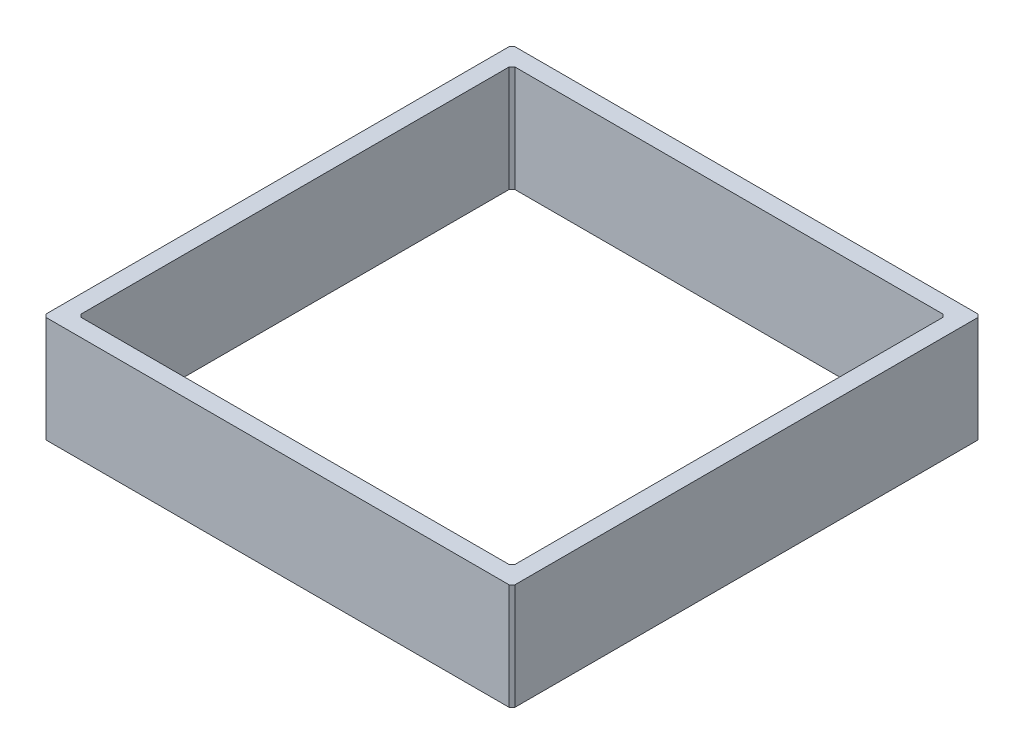
ISO-10303-21;
HEADER;
FILE_DESCRIPTION(('STEP AP214'),'2;1');
FILE_NAME('part.step','',(''),(''),'','','');
FILE_SCHEMA(('AUTOMOTIVE_DESIGN { 1 0 10303 214 1 1 1 1 }'));
ENDSEC;
DATA;
#1=APPLICATION_CONTEXT('core data for automotive mechanical design processes');
#2=APPLICATION_PROTOCOL_DEFINITION('international standard','automotive_design',2000,#1);
#3=PRODUCT_CONTEXT('',#1,'mechanical');
#4=PRODUCT('Part','Part','',(#3));
#5=PRODUCT_RELATED_PRODUCT_CATEGORY('part','',(#4));
#6=PRODUCT_DEFINITION_FORMATION('','',#4);
#7=PRODUCT_DEFINITION_CONTEXT('part definition',#1,'design');
#8=PRODUCT_DEFINITION('design','',#6,#7);
#9=PRODUCT_DEFINITION_SHAPE('','',#8);
#10=(LENGTH_UNIT() NAMED_UNIT(*) SI_UNIT(.MILLI.,.METRE.));
#11=(NAMED_UNIT(*) PLANE_ANGLE_UNIT() SI_UNIT($,.RADIAN.));
#12=(NAMED_UNIT(*) SI_UNIT($,.STERADIAN.) SOLID_ANGLE_UNIT());
#13=UNCERTAINTY_MEASURE_WITH_UNIT(LENGTH_MEASURE(1.E-05),#10,'distance_accuracy_value','');
#14=(GEOMETRIC_REPRESENTATION_CONTEXT(3) GLOBAL_UNCERTAINTY_ASSIGNED_CONTEXT((#13)) GLOBAL_UNIT_ASSIGNED_CONTEXT((#10,
#11,#12)) REPRESENTATION_CONTEXT('',''));
#15=CARTESIAN_POINT('',(0.,0.,0.));
#16=DIRECTION('',(0.,0.,1.));
#17=DIRECTION('',(1.,0.,0.));
#18=AXIS2_PLACEMENT_3D('',#15,#16,#17);
#19=CARTESIAN_POINT('',(66.621580604534,-28.7528,40.2390144836272));
#20=DIRECTION('',(-0.707106781186551,0.,-0.707106781186544));
#21=DIRECTION('',(-0.707106781186544,0.,0.707106781186551));
#22=AXIS2_PLACEMENT_3D('',#19,#20,#21);
#23=PLANE('',#22);
#24=DIRECTION('',(-0.707106781186544,0.,0.707106781186551));
#25=VECTOR('',#24,1.);
#26=CARTESIAN_POINT('',(66.621580604534,0.,40.2390144836272));
#27=LINE('',#26,#25);
#28=CARTESIAN_POINT('',(65.827830604534,0.,41.0327644836272));
#29=VERTEX_POINT('',#28);
#30=CARTESIAN_POINT('',(66.621580604534,0.,40.2390144836272));
#31=VERTEX_POINT('',#30);
#32=EDGE_CURVE('E205',#29,#31,#27,.F.);
#33=ORIENTED_EDGE('',*,*,#32,.T.);
#34=DIRECTION('',(0.,1.,0.));
#35=VECTOR('',#34,1.);
#36=CARTESIAN_POINT('',(66.621580604534,-28.7528,40.2390144836272));
#37=LINE('',#36,#35);
#38=CARTESIAN_POINT('',(66.621580604534,-28.7528,40.2390144836272));
#39=VERTEX_POINT('',#38);
#40=EDGE_CURVE('E188',#31,#39,#37,.F.);
#41=ORIENTED_EDGE('',*,*,#40,.T.);
#42=DIRECTION('',(-0.707106781186544,0.,0.707106781186551));
#43=VECTOR('',#42,1.);
#44=CARTESIAN_POINT('',(66.621580604534,-28.7528,40.2390144836272));
#45=LINE('',#44,#43);
#46=CARTESIAN_POINT('',(65.827830604534,-28.7528,41.0327644836272));
#47=VERTEX_POINT('',#46);
#48=EDGE_CURVE('E20',#39,#47,#45,.T.);
#49=ORIENTED_EDGE('',*,*,#48,.T.);
#50=DIRECTION('',(0.,1.,0.));
#51=VECTOR('',#50,1.);
#52=CARTESIAN_POINT('',(65.827830604534,-28.7528,41.0327644836272));
#53=LINE('',#52,#51);
#54=EDGE_CURVE('E154',#47,#29,#53,.T.);
#55=ORIENTED_EDGE('',*,*,#54,.T.);
#56=EDGE_LOOP('',(#33,#41,#49,#55));
#57=FACE_BOUND('',#56,.T.);
#58=ADVANCED_FACE('F17',(#57),#23,.T.);
#59=CARTESIAN_POINT('',(-50.059669395466,-28.7528,41.0327644836272));
#60=DIRECTION('',(0.707106781186551,0.,-0.707106781186544));
#61=DIRECTION('',(-0.707106781186544,0.,-0.707106781186551));
#62=AXIS2_PLACEMENT_3D('',#59,#60,#61);
#63=PLANE('',#62);
#64=DIRECTION('',(-0.707106781186544,0.,-0.707106781186551));
#65=VECTOR('',#64,1.);
#66=CARTESIAN_POINT('',(-50.059669395466,0.,41.0327644836272));
#67=LINE('',#66,#65);
#68=CARTESIAN_POINT('',(-50.853419395466,0.,40.2390144836272));
#69=VERTEX_POINT('',#68);
#70=CARTESIAN_POINT('',(-50.059669395466,0.,41.0327644836272));
#71=VERTEX_POINT('',#70);
#72=EDGE_CURVE('E128',#69,#71,#67,.F.);
#73=ORIENTED_EDGE('',*,*,#72,.T.);
#74=DIRECTION('',(0.,1.,0.));
#75=VECTOR('',#74,1.);
#76=CARTESIAN_POINT('',(-50.059669395466,-28.7528,41.0327644836272));
#77=LINE('',#76,#75);
#78=CARTESIAN_POINT('',(-50.059669395466,-28.7528,41.0327644836272));
#79=VERTEX_POINT('',#78);
#80=EDGE_CURVE('E182',#71,#79,#77,.F.);
#81=ORIENTED_EDGE('',*,*,#80,.T.);
#82=DIRECTION('',(-0.707106781186544,0.,-0.707106781186551));
#83=VECTOR('',#82,1.);
#84=CARTESIAN_POINT('',(-50.059669395466,-28.7528,41.0327644836272));
#85=LINE('',#84,#83);
#86=CARTESIAN_POINT('',(-50.853419395466,-28.7528,40.2390144836272));
#87=VERTEX_POINT('',#86);
#88=EDGE_CURVE('E204',#79,#87,#85,.T.);
#89=ORIENTED_EDGE('',*,*,#88,.T.);
#90=DIRECTION('',(0.,1.,0.));
#91=VECTOR('',#90,1.);
#92=CARTESIAN_POINT('',(-50.853419395466,-28.7528,40.2390144836272));
#93=LINE('',#92,#91);
#94=EDGE_CURVE('E153',#87,#69,#93,.T.);
#95=ORIENTED_EDGE('',*,*,#94,.T.);
#96=EDGE_LOOP('',(#73,#81,#89,#95));
#97=FACE_BOUND('',#96,.T.);
#98=ADVANCED_FACE('F409',(#97),#63,.T.);
#99=CARTESIAN_POINT('',(-50.853419395466,-28.7528,-75.6484855163728));
#100=DIRECTION('',(0.707106781186548,0.,0.707106781186548));
#101=DIRECTION('',(0.707106781186548,0.,-0.707106781186548));
#102=AXIS2_PLACEMENT_3D('',#99,#100,#101);
#103=PLANE('',#102);
#104=DIRECTION('',(0.707106781186548,0.,-0.707106781186548));
#105=VECTOR('',#104,1.);
#106=CARTESIAN_POINT('',(-50.853419395466,0.,-75.6484855163728));
#107=LINE('',#106,#105);
#108=CARTESIAN_POINT('',(-50.059669395466,0.,-76.4422355163728));
#109=VERTEX_POINT('',#108);
#110=CARTESIAN_POINT('',(-50.853419395466,0.,-75.6484855163728));
#111=VERTEX_POINT('',#110);
#112=EDGE_CURVE('E134',#109,#111,#107,.F.);
#113=ORIENTED_EDGE('',*,*,#112,.T.);
#114=DIRECTION('',(0.,1.,0.));
#115=VECTOR('',#114,1.);
#116=CARTESIAN_POINT('',(-50.853419395466,-28.7528,-75.6484855163728));
#117=LINE('',#116,#115);
#118=CARTESIAN_POINT('',(-50.853419395466,-28.7528,-75.6484855163728));
#119=VERTEX_POINT('',#118);
#120=EDGE_CURVE('E137',#111,#119,#117,.F.);
#121=ORIENTED_EDGE('',*,*,#120,.T.);
#122=DIRECTION('',(0.707106781186548,0.,-0.707106781186548));
#123=VECTOR('',#122,1.);
#124=CARTESIAN_POINT('',(-50.853419395466,-28.7528,-75.6484855163728));
#125=LINE('',#124,#123);
#126=CARTESIAN_POINT('',(-50.059669395466,-28.7528,-76.4422355163728));
#127=VERTEX_POINT('',#126);
#128=EDGE_CURVE('E144',#119,#127,#125,.T.);
#129=ORIENTED_EDGE('',*,*,#128,.T.);
#130=DIRECTION('',(0.,1.,0.));
#131=VECTOR('',#130,1.);
#132=CARTESIAN_POINT('',(-50.059669395466,-28.7528,-76.4422355163728));
#133=LINE('',#132,#131);
#134=EDGE_CURVE('E140',#127,#109,#133,.T.);
#135=ORIENTED_EDGE('',*,*,#134,.T.);
#136=EDGE_LOOP('',(#113,#121,#129,#135));
#137=FACE_BOUND('',#136,.T.);
#138=ADVANCED_FACE('F136',(#137),#103,.T.);
#139=CARTESIAN_POINT('',(65.827830604534,-28.7528,-76.4422355163728));
#140=DIRECTION('',(-0.707106781186548,0.,0.707106781186548));
#141=DIRECTION('',(0.707106781186548,0.,0.707106781186548));
#142=AXIS2_PLACEMENT_3D('',#139,#140,#141);
#143=PLANE('',#142);
#144=DIRECTION('',(0.707106781186548,0.,0.707106781186548));
#145=VECTOR('',#144,1.);
#146=CARTESIAN_POINT('',(65.827830604534,0.,-76.4422355163728));
#147=LINE('',#146,#145);
#148=CARTESIAN_POINT('',(66.621580604534,0.,-75.6484855163728));
#149=VERTEX_POINT('',#148);
#150=CARTESIAN_POINT('',(65.827830604534,0.,-76.4422355163728));
#151=VERTEX_POINT('',#150);
#152=EDGE_CURVE('E199',#149,#151,#147,.F.);
#153=ORIENTED_EDGE('',*,*,#152,.T.);
#154=DIRECTION('',(0.,1.,0.));
#155=VECTOR('',#154,1.);
#156=CARTESIAN_POINT('',(65.827830604534,-28.7528,-76.4422355163728));
#157=LINE('',#156,#155);
#158=CARTESIAN_POINT('',(65.827830604534,-28.7528,-76.4422355163728));
#159=VERTEX_POINT('',#158);
#160=EDGE_CURVE('E175',#151,#159,#157,.F.);
#161=ORIENTED_EDGE('',*,*,#160,.T.);
#162=DIRECTION('',(0.707106781186548,0.,0.707106781186548));
#163=VECTOR('',#162,1.);
#164=CARTESIAN_POINT('',(65.827830604534,-28.7528,-76.4422355163728));
#165=LINE('',#164,#163);
#166=CARTESIAN_POINT('',(66.621580604534,-28.7528,-75.6484855163728));
#167=VERTEX_POINT('',#166);
#168=EDGE_CURVE('E143',#159,#167,#165,.T.);
#169=ORIENTED_EDGE('',*,*,#168,.T.);
#170=DIRECTION('',(0.,1.,0.));
#171=VECTOR('',#170,1.);
#172=CARTESIAN_POINT('',(66.621580604534,-28.7528,-75.6484855163728));
#173=LINE('',#172,#171);
#174=EDGE_CURVE('E185',#167,#149,#173,.T.);
#175=ORIENTED_EDGE('',*,*,#174,.T.);
#176=EDGE_LOOP('',(#153,#161,#169,#175));
#177=FACE_BOUND('',#176,.T.);
#178=ADVANCED_FACE('F250',(#177),#143,.T.);
#179=CARTESIAN_POINT('',(71.384080604534,-28.7528,-80.4109855163728));
#180=DIRECTION('',(-0.707106781186541,0.,0.707106781186554));
#181=DIRECTION('',(0.707106781186554,0.,0.707106781186541));
#182=AXIS2_PLACEMENT_3D('',#179,#180,#181);
#183=PLANE('',#182);
#184=DIRECTION('',(0.,1.,0.));
#185=VECTOR('',#184,1.);
#186=CARTESIAN_POINT('',(70.590330604534,-28.7528,-81.2047355163728));
#187=LINE('',#186,#185);
#188=CARTESIAN_POINT('',(70.590330604534,0.,-81.2047355163728));
#189=VERTEX_POINT('',#188);
#190=CARTESIAN_POINT('',(70.590330604534,-28.7528,-81.2047355163728));
#191=VERTEX_POINT('',#190);
#192=EDGE_CURVE('E163',#189,#191,#187,.F.);
#193=ORIENTED_EDGE('',*,*,#192,.F.);
#194=DIRECTION('',(0.707106781186554,0.,0.707106781186541));
#195=VECTOR('',#194,1.);
#196=CARTESIAN_POINT('',(71.384080604534,0.,-80.4109855163728));
#197=LINE('',#196,#195);
#198=CARTESIAN_POINT('',(71.384080604534,0.,-80.4109855163728));
#199=VERTEX_POINT('',#198);
#200=EDGE_CURVE('E197',#199,#189,#197,.F.);
#201=ORIENTED_EDGE('',*,*,#200,.F.);
#202=DIRECTION('',(0.,1.,0.));
#203=VECTOR('',#202,1.);
#204=CARTESIAN_POINT('',(71.384080604534,-28.7528,-80.4109855163728));
#205=LINE('',#204,#203);
#206=CARTESIAN_POINT('',(71.384080604534,-28.7528,-80.4109855163728));
#207=VERTEX_POINT('',#206);
#208=EDGE_CURVE('E172',#207,#199,#205,.T.);
#209=ORIENTED_EDGE('',*,*,#208,.F.);
#210=DIRECTION('',(0.707106781186554,0.,0.707106781186541));
#211=VECTOR('',#210,1.);
#212=CARTESIAN_POINT('',(71.384080604534,-28.7528,-80.4109855163728));
#213=LINE('',#212,#211);
#214=EDGE_CURVE('E195',#191,#207,#213,.T.);
#215=ORIENTED_EDGE('',*,*,#214,.F.);
#216=EDGE_LOOP('',(#193,#201,#209,#215));
#217=FACE_BOUND('',#216,.T.);
#218=ADVANCED_FACE('F291',(#217),#183,.F.);
#219=CARTESIAN_POINT('',(70.590330604534,-28.7528,45.7952644836272));
#220=DIRECTION('',(-0.707106781186551,0.,-0.707106781186544));
#221=DIRECTION('',(-0.707106781186544,0.,0.707106781186551));
#222=AXIS2_PLACEMENT_3D('',#219,#220,#221);
#223=PLANE('',#222);
#224=DIRECTION('',(0.,1.,0.));
#225=VECTOR('',#224,1.);
#226=CARTESIAN_POINT('',(71.384080604534,-28.7528,45.0015144836272));
#227=LINE('',#226,#225);
#228=CARTESIAN_POINT('',(71.384080604534,0.,45.0015144836272));
#229=VERTEX_POINT('',#228);
#230=CARTESIAN_POINT('',(71.384080604534,-28.7528,45.0015144836272));
#231=VERTEX_POINT('',#230);
#232=EDGE_CURVE('E169',#229,#231,#227,.F.);
#233=ORIENTED_EDGE('',*,*,#232,.F.);
#234=DIRECTION('',(-0.707106781186544,0.,0.707106781186551));
#235=VECTOR('',#234,1.);
#236=CARTESIAN_POINT('',(70.590330604534,0.,45.7952644836272));
#237=LINE('',#236,#235);
#238=CARTESIAN_POINT('',(70.590330604534,0.,45.7952644836272));
#239=VERTEX_POINT('',#238);
#240=EDGE_CURVE('E193',#239,#229,#237,.F.);
#241=ORIENTED_EDGE('',*,*,#240,.F.);
#242=DIRECTION('',(0.,1.,0.));
#243=VECTOR('',#242,1.);
#244=CARTESIAN_POINT('',(70.590330604534,-28.7528,45.7952644836272));
#245=LINE('',#244,#243);
#246=CARTESIAN_POINT('',(70.590330604534,-28.7528,45.7952644836272));
#247=VERTEX_POINT('',#246);
#248=EDGE_CURVE('E158',#247,#239,#245,.T.);
#249=ORIENTED_EDGE('',*,*,#248,.F.);
#250=DIRECTION('',(-0.707106781186544,0.,0.707106781186551));
#251=VECTOR('',#250,1.);
#252=CARTESIAN_POINT('',(70.590330604534,-28.7528,45.7952644836272));
#253=LINE('',#252,#251);
#254=EDGE_CURVE('E191',#231,#247,#253,.T.);
#255=ORIENTED_EDGE('',*,*,#254,.F.);
#256=EDGE_LOOP('',(#233,#241,#249,#255));
#257=FACE_BOUND('',#256,.T.);
#258=ADVANCED_FACE('F300',(#257),#223,.F.);
#259=CARTESIAN_POINT('',(66.621580604534,-28.7528,41.0327644836272));
#260=DIRECTION('',(1.,0.,0.));
#261=DIRECTION('',(0.,0.,-1.));
#262=AXIS2_PLACEMENT_3D('',#259,#260,#261);
#263=PLANE('',#262);
#264=ORIENTED_EDGE('',*,*,#174,.F.);
#265=DIRECTION('',(0.,0.,1.));
#266=VECTOR('',#265,1.);
#267=CARTESIAN_POINT('',(66.621580604534,-28.7528,45.7952644836272));
#268=LINE('',#267,#266);
#269=EDGE_CURVE('E221',#167,#39,#268,.T.);
#270=ORIENTED_EDGE('',*,*,#269,.T.);
#271=ORIENTED_EDGE('',*,*,#40,.F.);
#272=DIRECTION('',(0.,0.,1.));
#273=VECTOR('',#272,1.);
#274=CARTESIAN_POINT('',(66.621580604534,0.,45.7952644836272));
#275=LINE('',#274,#273);
#276=EDGE_CURVE('E160',#149,#31,#275,.T.);
#277=ORIENTED_EDGE('',*,*,#276,.F.);
#278=EDGE_LOOP('',(#264,#270,#271,#277));
#279=FACE_BOUND('',#278,.T.);
#280=ADVANCED_FACE('F245',(#279),#263,.F.);
#281=CARTESIAN_POINT('',(-50.853419395466,-28.7528,41.0327644836272));
#282=DIRECTION('',(0.,0.,1.));
#283=DIRECTION('',(1.,0.,0.));
#284=AXIS2_PLACEMENT_3D('',#281,#282,#283);
#285=PLANE('',#284);
#286=ORIENTED_EDGE('',*,*,#54,.F.);
#287=DIRECTION('',(1.,0.,0.));
#288=VECTOR('',#287,1.);
#289=CARTESIAN_POINT('',(-55.615919395466,-28.7528,41.0327644836272));
#290=LINE('',#289,#288);
#291=EDGE_CURVE('E218',#47,#79,#290,.F.);
#292=ORIENTED_EDGE('',*,*,#291,.T.);
#293=ORIENTED_EDGE('',*,*,#80,.F.);
#294=DIRECTION('',(1.,0.,0.));
#295=VECTOR('',#294,1.);
#296=CARTESIAN_POINT('',(-55.615919395466,0.,41.0327644836272));
#297=LINE('',#296,#295);
#298=EDGE_CURVE('E219',#29,#71,#297,.F.);
#299=ORIENTED_EDGE('',*,*,#298,.F.);
#300=EDGE_LOOP('',(#286,#292,#293,#299));
#301=FACE_BOUND('',#300,.T.);
#302=ADVANCED_FACE('F216',(#301),#285,.F.);
#303=CARTESIAN_POINT('',(-50.853419395466,-28.7528,-76.4422355163728));
#304=DIRECTION('',(-1.,0.,0.));
#305=DIRECTION('',(0.,0.,1.));
#306=AXIS2_PLACEMENT_3D('',#303,#304,#305);
#307=PLANE('',#306);
#308=ORIENTED_EDGE('',*,*,#94,.F.);
#309=DIRECTION('',(0.,0.,1.));
#310=VECTOR('',#309,1.);
#311=CARTESIAN_POINT('',(-50.853419395466,-28.7528,45.7952644836272));
#312=LINE('',#311,#310);
#313=EDGE_CURVE('E152',#87,#119,#312,.F.);
#314=ORIENTED_EDGE('',*,*,#313,.T.);
#315=ORIENTED_EDGE('',*,*,#120,.F.);
#316=DIRECTION('',(0.,0.,1.));
#317=VECTOR('',#316,1.);
#318=CARTESIAN_POINT('',(-50.853419395466,0.,45.7952644836272));
#319=LINE('',#318,#317);
#320=EDGE_CURVE('E150',#69,#111,#319,.F.);
#321=ORIENTED_EDGE('',*,*,#320,.F.);
#322=EDGE_LOOP('',(#308,#314,#315,#321));
#323=FACE_BOUND('',#322,.T.);
#324=ADVANCED_FACE('F149',(#323),#307,.F.);
#325=CARTESIAN_POINT('',(66.621580604534,-28.7528,-76.4422355163728));
#326=DIRECTION('',(0.,0.,-1.));
#327=DIRECTION('',(-1.,0.,0.));
#328=AXIS2_PLACEMENT_3D('',#325,#326,#327);
#329=PLANE('',#328);
#330=ORIENTED_EDGE('',*,*,#160,.F.);
#331=DIRECTION('',(1.,0.,0.));
#332=VECTOR('',#331,1.);
#333=CARTESIAN_POINT('',(-55.615919395466,0.,-76.4422355163728));
#334=LINE('',#333,#332);
#335=EDGE_CURVE('E157',#109,#151,#334,.T.);
#336=ORIENTED_EDGE('',*,*,#335,.F.);
#337=ORIENTED_EDGE('',*,*,#134,.F.);
#338=DIRECTION('',(1.,0.,0.));
#339=VECTOR('',#338,1.);
#340=CARTESIAN_POINT('',(-55.615919395466,-28.7528,-76.4422355163728));
#341=LINE('',#340,#339);
#342=EDGE_CURVE('E223',#127,#159,#341,.T.);
#343=ORIENTED_EDGE('',*,*,#342,.T.);
#344=EDGE_LOOP('',(#330,#336,#337,#343));
#345=FACE_BOUND('',#344,.T.);
#346=ADVANCED_FACE('F252',(#345),#329,.F.);
#347=CARTESIAN_POINT('',(71.384080604534,-28.7528,45.7952644836272));
#348=DIRECTION('',(1.,0.,0.));
#349=DIRECTION('',(0.,0.,-1.));
#350=AXIS2_PLACEMENT_3D('',#347,#348,#349);
#351=PLANE('',#350);
#352=DIRECTION('',(0.,0.,1.));
#353=VECTOR('',#352,1.);
#354=CARTESIAN_POINT('',(71.384080604534,0.,45.7952644836272));
#355=LINE('',#354,#353);
#356=EDGE_CURVE('E238',#229,#199,#355,.F.);
#357=ORIENTED_EDGE('',*,*,#356,.F.);
#358=ORIENTED_EDGE('',*,*,#232,.T.);
#359=DIRECTION('',(0.,0.,1.));
#360=VECTOR('',#359,1.);
#361=CARTESIAN_POINT('',(71.384080604534,-28.7528,45.7952644836272));
#362=LINE('',#361,#360);
#363=EDGE_CURVE('E259',#231,#207,#362,.F.);
#364=ORIENTED_EDGE('',*,*,#363,.T.);
#365=ORIENTED_EDGE('',*,*,#208,.T.);
#366=EDGE_LOOP('',(#357,#358,#364,#365));
#367=FACE_BOUND('',#366,.T.);
#368=ADVANCED_FACE('F297',(#367),#351,.T.);
#369=CARTESIAN_POINT('',(71.384080604534,-28.7528,-81.2047355163728));
#370=DIRECTION('',(0.,0.,-1.));
#371=DIRECTION('',(-1.,0.,0.));
#372=AXIS2_PLACEMENT_3D('',#369,#370,#371);
#373=PLANE('',#372);
#374=DIRECTION('',(1.,0.,0.));
#375=VECTOR('',#374,1.);
#376=CARTESIAN_POINT('',(-55.615919395466,-28.7528,-81.2047355163728));
#377=LINE('',#376,#375);
#378=CARTESIAN_POINT('',(-54.8221693954659,-28.7528,-81.2047355163728));
#379=VERTEX_POINT('',#378);
#380=EDGE_CURVE('E262',#191,#379,#377,.F.);
#381=ORIENTED_EDGE('',*,*,#380,.T.);
#382=DIRECTION('',(0.,1.,0.));
#383=VECTOR('',#382,1.);
#384=CARTESIAN_POINT('',(-54.8221693954659,-28.7528,-81.2047355163728));
#385=LINE('',#384,#383);
#386=CARTESIAN_POINT('',(-54.8221693954659,0.,-81.2047355163728));
#387=VERTEX_POINT('',#386);
#388=EDGE_CURVE('E230',#379,#387,#385,.T.);
#389=ORIENTED_EDGE('',*,*,#388,.T.);
#390=DIRECTION('',(1.,0.,0.));
#391=VECTOR('',#390,1.);
#392=CARTESIAN_POINT('',(-55.615919395466,0.,-81.2047355163728));
#393=LINE('',#392,#391);
#394=EDGE_CURVE('E235',#189,#387,#393,.F.);
#395=ORIENTED_EDGE('',*,*,#394,.F.);
#396=ORIENTED_EDGE('',*,*,#192,.T.);
#397=EDGE_LOOP('',(#381,#389,#395,#396));
#398=FACE_BOUND('',#397,.T.);
#399=ADVANCED_FACE('F288',(#398),#373,.T.);
#400=CARTESIAN_POINT('',(-55.615919395466,-28.7528,45.7952644836272));
#401=DIRECTION('',(0.,0.,1.));
#402=DIRECTION('',(1.,0.,0.));
#403=AXIS2_PLACEMENT_3D('',#400,#401,#402);
#404=PLANE('',#403);
#405=DIRECTION('',(1.,0.,0.));
#406=VECTOR('',#405,1.);
#407=CARTESIAN_POINT('',(-55.615919395466,0.,45.7952644836272));
#408=LINE('',#407,#406);
#409=CARTESIAN_POINT('',(-54.822169395466,0.,45.7952644836272));
#410=VERTEX_POINT('',#409);
#411=EDGE_CURVE('E232',#410,#239,#408,.T.);
#412=ORIENTED_EDGE('',*,*,#411,.F.);
#413=DIRECTION('',(0.,1.,0.));
#414=VECTOR('',#413,1.);
#415=CARTESIAN_POINT('',(-54.822169395466,-28.7528,45.7952644836272));
#416=LINE('',#415,#414);
#417=CARTESIAN_POINT('',(-54.822169395466,-28.7528,45.7952644836272));
#418=VERTEX_POINT('',#417);
#419=EDGE_CURVE('E268',#410,#418,#416,.F.);
#420=ORIENTED_EDGE('',*,*,#419,.T.);
#421=DIRECTION('',(1.,0.,0.));
#422=VECTOR('',#421,1.);
#423=CARTESIAN_POINT('',(-55.615919395466,-28.7528,45.7952644836272));
#424=LINE('',#423,#422);
#425=EDGE_CURVE('E254',#418,#247,#424,.T.);
#426=ORIENTED_EDGE('',*,*,#425,.T.);
#427=ORIENTED_EDGE('',*,*,#248,.T.);
#428=EDGE_LOOP('',(#412,#420,#426,#427));
#429=FACE_BOUND('',#428,.T.);
#430=ADVANCED_FACE('F302',(#429),#404,.T.);
#431=CARTESIAN_POINT('',(-55.615919395466,0.,45.7952644836272));
#432=DIRECTION('',(0.,1.,0.));
#433=DIRECTION('',(0.,0.,1.));
#434=AXIS2_PLACEMENT_3D('',#431,#432,#433);
#435=PLANE('',#434);
#436=ORIENTED_EDGE('',*,*,#411,.T.);
#437=ORIENTED_EDGE('',*,*,#240,.T.);
#438=ORIENTED_EDGE('',*,*,#356,.T.);
#439=ORIENTED_EDGE('',*,*,#200,.T.);
#440=ORIENTED_EDGE('',*,*,#394,.T.);
#441=DIRECTION('',(0.707106781186551,0.,-0.707106781186544));
#442=VECTOR('',#441,1.);
#443=CARTESIAN_POINT('',(-54.822169395466,0.,-81.2047355163728));
#444=LINE('',#443,#442);
#445=CARTESIAN_POINT('',(-55.615919395466,0.,-80.4109855163728));
#446=VERTEX_POINT('',#445);
#447=EDGE_CURVE('E225',#387,#446,#444,.F.);
#448=ORIENTED_EDGE('',*,*,#447,.T.);
#449=DIRECTION('',(0.,0.,1.));
#450=VECTOR('',#449,1.);
#451=CARTESIAN_POINT('',(-55.615919395466,0.,-81.2047355163728));
#452=LINE('',#451,#450);
#453=CARTESIAN_POINT('',(-55.615919395466,0.,45.0015144836272));
#454=VERTEX_POINT('',#453);
#455=EDGE_CURVE('E271',#454,#446,#452,.F.);
#456=ORIENTED_EDGE('',*,*,#455,.F.);
#457=DIRECTION('',(-0.707106781186544,0.,-0.707106781186551));
#458=VECTOR('',#457,1.);
#459=CARTESIAN_POINT('',(-55.615919395466,0.,45.0015144836272));
#460=LINE('',#459,#458);
#461=EDGE_CURVE('E265',#454,#410,#460,.F.);
#462=ORIENTED_EDGE('',*,*,#461,.T.);
#463=EDGE_LOOP('',(#436,#437,#438,#439,#440,#448,#456,#462));
#464=FACE_BOUND('',#463,.T.);
#465=ORIENTED_EDGE('',*,*,#298,.T.);
#466=ORIENTED_EDGE('',*,*,#72,.F.);
#467=ORIENTED_EDGE('',*,*,#320,.T.);
#468=ORIENTED_EDGE('',*,*,#112,.F.);
#469=ORIENTED_EDGE('',*,*,#335,.T.);
#470=ORIENTED_EDGE('',*,*,#152,.F.);
#471=ORIENTED_EDGE('',*,*,#276,.T.);
#472=ORIENTED_EDGE('',*,*,#32,.F.);
#473=EDGE_LOOP('',(#465,#466,#467,#468,#469,#470,#471,#472));
#474=FACE_BOUND('',#473,.T.);
#475=ADVANCED_FACE('F156',(#464,#474),#435,.T.);
#476=CARTESIAN_POINT('',(-54.822169395466,-28.7528,-81.2047355163728));
#477=DIRECTION('',(0.707106781186544,0.,0.707106781186551));
#478=DIRECTION('',(0.707106781186551,0.,-0.707106781186544));
#479=AXIS2_PLACEMENT_3D('',#476,#477,#478);
#480=PLANE('',#479);
#481=DIRECTION('',(0.,1.,0.));
#482=VECTOR('',#481,1.);
#483=CARTESIAN_POINT('',(-55.615919395466,-28.7528,-80.4109855163728));
#484=LINE('',#483,#482);
#485=CARTESIAN_POINT('',(-55.615919395466,-28.7528,-80.4109855163728));
#486=VERTEX_POINT('',#485);
#487=EDGE_CURVE('E274',#446,#486,#484,.F.);
#488=ORIENTED_EDGE('',*,*,#487,.F.);
#489=ORIENTED_EDGE('',*,*,#447,.F.);
#490=ORIENTED_EDGE('',*,*,#388,.F.);
#491=DIRECTION('',(-0.7071067811866,0.,0.707106781186495));
#492=VECTOR('',#491,1.);
#493=CARTESIAN_POINT('',(-54.8221693954659,-28.7528,-81.2047355163728));
#494=LINE('',#493,#492);
#495=EDGE_CURVE('E253',#379,#486,#494,.T.);
#496=ORIENTED_EDGE('',*,*,#495,.T.);
#497=EDGE_LOOP('',(#488,#489,#490,#496));
#498=FACE_BOUND('',#497,.T.);
#499=ADVANCED_FACE('F284',(#498),#480,.F.);
#500=CARTESIAN_POINT('',(-55.615919395466,-28.7528,45.7952644836272));
#501=DIRECTION('',(0.,1.,0.));
#502=DIRECTION('',(0.,0.,1.));
#503=AXIS2_PLACEMENT_3D('',#500,#501,#502);
#504=PLANE('',#503);
#505=ORIENTED_EDGE('',*,*,#214,.T.);
#506=ORIENTED_EDGE('',*,*,#363,.F.);
#507=ORIENTED_EDGE('',*,*,#254,.T.);
#508=ORIENTED_EDGE('',*,*,#425,.F.);
#509=DIRECTION('',(-0.707106781186544,0.,-0.707106781186551));
#510=VECTOR('',#509,1.);
#511=CARTESIAN_POINT('',(-55.615919395466,-28.7528,45.0015144836272));
#512=LINE('',#511,#510);
#513=CARTESIAN_POINT('',(-55.615919395466,-28.7528,45.0015144836272));
#514=VERTEX_POINT('',#513);
#515=EDGE_CURVE('E35',#418,#514,#512,.T.);
#516=ORIENTED_EDGE('',*,*,#515,.T.);
#517=DIRECTION('',(0.,0.,1.));
#518=VECTOR('',#517,1.);
#519=CARTESIAN_POINT('',(-55.615919395466,-28.7528,-81.2047355163728));
#520=LINE('',#519,#518);
#521=EDGE_CURVE('E26',#486,#514,#520,.T.);
#522=ORIENTED_EDGE('',*,*,#521,.F.);
#523=ORIENTED_EDGE('',*,*,#495,.F.);
#524=ORIENTED_EDGE('',*,*,#380,.F.);
#525=EDGE_LOOP('',(#505,#506,#507,#508,#516,#522,#523,#524));
#526=FACE_BOUND('',#525,.T.);
#527=ORIENTED_EDGE('',*,*,#128,.F.);
#528=ORIENTED_EDGE('',*,*,#313,.F.);
#529=ORIENTED_EDGE('',*,*,#88,.F.);
#530=ORIENTED_EDGE('',*,*,#291,.F.);
#531=ORIENTED_EDGE('',*,*,#48,.F.);
#532=ORIENTED_EDGE('',*,*,#269,.F.);
#533=ORIENTED_EDGE('',*,*,#168,.F.);
#534=ORIENTED_EDGE('',*,*,#342,.F.);
#535=EDGE_LOOP('',(#527,#528,#529,#530,#531,#532,#533,#534));
#536=FACE_BOUND('',#535,.T.);
#537=ADVANCED_FACE('F220',(#526,#536),#504,.F.);
#538=CARTESIAN_POINT('',(-55.615919395466,-28.7528,45.0015144836272));
#539=DIRECTION('',(0.707106781186551,0.,-0.707106781186544));
#540=DIRECTION('',(-0.707106781186544,0.,-0.707106781186551));
#541=AXIS2_PLACEMENT_3D('',#538,#539,#540);
#542=PLANE('',#541);
#543=ORIENTED_EDGE('',*,*,#419,.F.);
#544=ORIENTED_EDGE('',*,*,#461,.F.);
#545=DIRECTION('',(0.,1.,0.));
#546=VECTOR('',#545,1.);
#547=CARTESIAN_POINT('',(-55.615919395466,-28.7528,45.0015144836272));
#548=LINE('',#547,#546);
#549=EDGE_CURVE('E11',#514,#454,#548,.T.);
#550=ORIENTED_EDGE('',*,*,#549,.F.);
#551=ORIENTED_EDGE('',*,*,#515,.F.);
#552=EDGE_LOOP('',(#543,#544,#550,#551));
#553=FACE_BOUND('',#552,.T.);
#554=ADVANCED_FACE('F305',(#553),#542,.F.);
#555=CARTESIAN_POINT('',(-55.615919395466,-28.7528,-81.2047355163728));
#556=DIRECTION('',(-1.,0.,0.));
#557=DIRECTION('',(0.,0.,1.));
#558=AXIS2_PLACEMENT_3D('',#555,#556,#557);
#559=PLANE('',#558);
#560=ORIENTED_EDGE('',*,*,#521,.T.);
#561=ORIENTED_EDGE('',*,*,#549,.T.);
#562=ORIENTED_EDGE('',*,*,#455,.T.);
#563=ORIENTED_EDGE('',*,*,#487,.T.);
#564=EDGE_LOOP('',(#560,#561,#562,#563));
#565=FACE_BOUND('',#564,.T.);
#566=ADVANCED_FACE('F279',(#565),#559,.T.);
#567=CLOSED_SHELL('',(#58,#98,#138,#178,#218,#258,#280,#302,#324,#346,#368,#399,#430,#475,#499,
#537,#554,#566));
#568=MANIFOLD_SOLID_BREP('B1',#567);
#569=ADVANCED_BREP_SHAPE_REPRESENTATION('',(#18,#568),#14);
#570=SHAPE_DEFINITION_REPRESENTATION(#9,#569);
ENDSEC;
END-ISO-10303-21;
